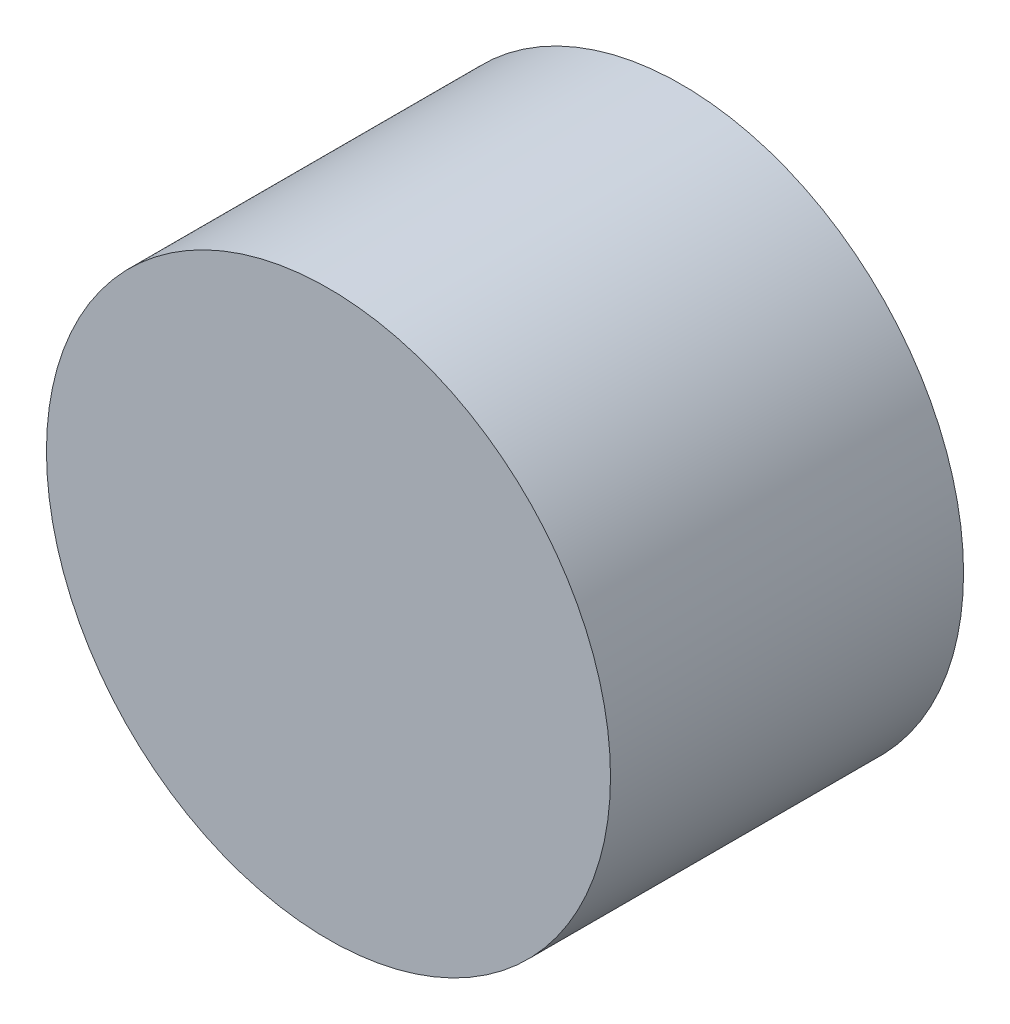
ISO-10303-21;
HEADER;
FILE_DESCRIPTION(('STEP AP214'),'2;1');
FILE_NAME('part.step','',(''),(''),'','','');
FILE_SCHEMA(('AUTOMOTIVE_DESIGN { 1 0 10303 214 1 1 1 1 }'));
ENDSEC;
DATA;
#1=APPLICATION_CONTEXT('core data for automotive mechanical design processes');
#2=APPLICATION_PROTOCOL_DEFINITION('international standard','automotive_design',2000,#1);
#3=PRODUCT_CONTEXT('',#1,'mechanical');
#4=PRODUCT('Part','Part','',(#3));
#5=PRODUCT_RELATED_PRODUCT_CATEGORY('part','',(#4));
#6=PRODUCT_DEFINITION_FORMATION('','',#4);
#7=PRODUCT_DEFINITION_CONTEXT('part definition',#1,'design');
#8=PRODUCT_DEFINITION('design','',#6,#7);
#9=PRODUCT_DEFINITION_SHAPE('','',#8);
#10=(LENGTH_UNIT() NAMED_UNIT(*) SI_UNIT(.MILLI.,.METRE.));
#11=(NAMED_UNIT(*) PLANE_ANGLE_UNIT() SI_UNIT($,.RADIAN.));
#12=(NAMED_UNIT(*) SI_UNIT($,.STERADIAN.) SOLID_ANGLE_UNIT());
#13=UNCERTAINTY_MEASURE_WITH_UNIT(LENGTH_MEASURE(1.E-05),#10,'distance_accuracy_value','');
#14=(GEOMETRIC_REPRESENTATION_CONTEXT(3) GLOBAL_UNCERTAINTY_ASSIGNED_CONTEXT((#13)) GLOBAL_UNIT_ASSIGNED_CONTEXT((#10,
#11,#12)) REPRESENTATION_CONTEXT('',''));
#15=CARTESIAN_POINT('',(0.,0.,0.));
#16=DIRECTION('',(0.,0.,1.));
#17=DIRECTION('',(1.,0.,0.));
#18=AXIS2_PLACEMENT_3D('',#15,#16,#17);
#19=CARTESIAN_POINT('',(-19.5880605457391,18.1475736568458,26.));
#20=DIRECTION('',(0.,0.,-1.));
#21=DIRECTION('',(-1.,0.,0.));
#22=AXIS2_PLACEMENT_3D('',#19,#20,#21);
#23=CYLINDRICAL_SURFACE('',#22,20.7701817802538);
#24=CARTESIAN_POINT('',(-19.5880605457391,18.1475736568458,26.));
#25=DIRECTION('',(0.,0.,1.));
#26=DIRECTION('',(1.,0.,0.));
#27=AXIS2_PLACEMENT_3D('',#24,#25,#26);
#28=CIRCLE('',#27,20.7701817802538);
#29=CARTESIAN_POINT('',(-40.3582423259929,18.1475736568458,26.));
#30=VERTEX_POINT('',#29);
#31=EDGE_CURVE('E10',#30,#30,#28,.T.);
#32=CARTESIAN_POINT('',(-19.5880605457391,18.1475736568458,0.));
#33=DIRECTION('',(0.,0.,1.));
#34=DIRECTION('',(1.,0.,0.));
#35=AXIS2_PLACEMENT_3D('',#32,#33,#34);
#36=CIRCLE('',#35,20.7701817802538);
#37=CARTESIAN_POINT('',(-40.3582423259929,18.1475736568458,0.));
#38=VERTEX_POINT('',#37);
#39=EDGE_CURVE('E40',#38,#38,#36,.T.);
#40=CARTESIAN_POINT('',(-40.3582423259929,18.1475736568458,26.));
#41=CARTESIAN_POINT('',(-40.3582423259929,18.1475736568458,25.7291666666667));
#42=CARTESIAN_POINT('',(-40.3582423259929,18.1475736568458,25.4583333333333));
#43=CARTESIAN_POINT('',(-40.3582423259929,18.1475736568458,24.9166666666667));
#44=CARTESIAN_POINT('',(-40.3582423259929,18.1475736568458,24.6458333333333));
#45=CARTESIAN_POINT('',(-40.3582423259929,18.1475736568458,24.1041666666667));
#46=CARTESIAN_POINT('',(-40.3582423259929,18.1475736568458,23.8333333333333));
#47=CARTESIAN_POINT('',(-40.3582423259929,18.1475736568458,23.2916666666667));
#48=CARTESIAN_POINT('',(-40.3582423259929,18.1475736568458,23.0208333333333));
#49=CARTESIAN_POINT('',(-40.3582423259929,18.1475736568458,22.4791666666667));
#50=CARTESIAN_POINT('',(-40.3582423259929,18.1475736568458,22.2083333333333));
#51=CARTESIAN_POINT('',(-40.3582423259929,18.1475736568458,21.6666666666667));
#52=CARTESIAN_POINT('',(-40.3582423259929,18.1475736568458,21.3958333333333));
#53=CARTESIAN_POINT('',(-40.3582423259929,18.1475736568458,20.8541666666667));
#54=CARTESIAN_POINT('',(-40.3582423259929,18.1475736568458,20.5833333333333));
#55=CARTESIAN_POINT('',(-40.3582423259929,18.1475736568458,20.0416666666667));
#56=CARTESIAN_POINT('',(-40.3582423259929,18.1475736568458,19.7708333333333));
#57=CARTESIAN_POINT('',(-40.3582423259929,18.1475736568458,19.2291666666667));
#58=CARTESIAN_POINT('',(-40.3582423259929,18.1475736568458,18.9583333333333));
#59=CARTESIAN_POINT('',(-40.3582423259929,18.1475736568458,18.4166666666667));
#60=CARTESIAN_POINT('',(-40.3582423259929,18.1475736568458,18.1458333333333));
#61=CARTESIAN_POINT('',(-40.3582423259929,18.1475736568458,17.6041666666667));
#62=CARTESIAN_POINT('',(-40.3582423259929,18.1475736568458,17.3333333333333));
#63=CARTESIAN_POINT('',(-40.3582423259929,18.1475736568458,16.7916666666667));
#64=CARTESIAN_POINT('',(-40.3582423259929,18.1475736568458,16.5208333333333));
#65=CARTESIAN_POINT('',(-40.3582423259929,18.1475736568458,15.9791666666667));
#66=CARTESIAN_POINT('',(-40.3582423259929,18.1475736568458,15.7083333333333));
#67=CARTESIAN_POINT('',(-40.3582423259929,18.1475736568458,15.1666666666667));
#68=CARTESIAN_POINT('',(-40.3582423259929,18.1475736568458,14.8958333333333));
#69=CARTESIAN_POINT('',(-40.3582423259929,18.1475736568458,14.3541666666667));
#70=CARTESIAN_POINT('',(-40.3582423259929,18.1475736568458,14.0833333333333));
#71=CARTESIAN_POINT('',(-40.3582423259929,18.1475736568458,13.5416666666667));
#72=CARTESIAN_POINT('',(-40.3582423259929,18.1475736568458,13.2708333333333));
#73=CARTESIAN_POINT('',(-40.3582423259929,18.1475736568458,12.7291666666667));
#74=CARTESIAN_POINT('',(-40.3582423259929,18.1475736568458,12.4583333333333));
#75=CARTESIAN_POINT('',(-40.3582423259929,18.1475736568458,11.9166666666667));
#76=CARTESIAN_POINT('',(-40.3582423259929,18.1475736568458,11.6458333333333));
#77=CARTESIAN_POINT('',(-40.3582423259929,18.1475736568458,11.1041666666667));
#78=CARTESIAN_POINT('',(-40.3582423259929,18.1475736568458,10.8333333333333));
#79=CARTESIAN_POINT('',(-40.3582423259929,18.1475736568458,10.2916666666667));
#80=CARTESIAN_POINT('',(-40.3582423259929,18.1475736568458,10.0208333333333));
#81=CARTESIAN_POINT('',(-40.3582423259929,18.1475736568458,9.47916666666667));
#82=CARTESIAN_POINT('',(-40.3582423259929,18.1475736568458,9.20833333333333));
#83=CARTESIAN_POINT('',(-40.3582423259929,18.1475736568458,8.66666666666667));
#84=CARTESIAN_POINT('',(-40.3582423259929,18.1475736568458,8.39583333333333));
#85=CARTESIAN_POINT('',(-40.3582423259929,18.1475736568458,7.85416666666667));
#86=CARTESIAN_POINT('',(-40.3582423259929,18.1475736568458,7.58333333333333));
#87=CARTESIAN_POINT('',(-40.3582423259929,18.1475736568458,7.04166666666667));
#88=CARTESIAN_POINT('',(-40.3582423259929,18.1475736568458,6.77083333333333));
#89=CARTESIAN_POINT('',(-40.3582423259929,18.1475736568458,6.22916666666667));
#90=CARTESIAN_POINT('',(-40.3582423259929,18.1475736568458,5.95833333333334));
#91=CARTESIAN_POINT('',(-40.3582423259929,18.1475736568458,5.41666666666667));
#92=CARTESIAN_POINT('',(-40.3582423259929,18.1475736568458,5.14583333333333));
#93=CARTESIAN_POINT('',(-40.3582423259929,18.1475736568458,4.60416666666667));
#94=CARTESIAN_POINT('',(-40.3582423259929,18.1475736568458,4.33333333333333));
#95=CARTESIAN_POINT('',(-40.3582423259929,18.1475736568458,3.79166666666667));
#96=CARTESIAN_POINT('',(-40.3582423259929,18.1475736568458,3.52083333333333));
#97=CARTESIAN_POINT('',(-40.3582423259929,18.1475736568458,2.97916666666667));
#98=CARTESIAN_POINT('',(-40.3582423259929,18.1475736568458,2.70833333333333));
#99=CARTESIAN_POINT('',(-40.3582423259929,18.1475736568458,2.16666666666667));
#100=CARTESIAN_POINT('',(-40.3582423259929,18.1475736568458,1.89583333333333));
#101=CARTESIAN_POINT('',(-40.3582423259929,18.1475736568458,1.35416666666666));
#102=CARTESIAN_POINT('',(-40.3582423259929,18.1475736568458,1.08333333333333));
#103=CARTESIAN_POINT('',(-40.3582423259929,18.1475736568458,0.541666666666664));
#104=CARTESIAN_POINT('',(-40.3582423259929,18.1475736568458,0.27083333333333));
#105=CARTESIAN_POINT('',(-40.3582423259929,18.1475736568458,0.));
#106=B_SPLINE_CURVE_WITH_KNOTS('',3,(#40,#41,#42,#43,#44,#45,#46,#47,#48,#49,#50,#51,#52,#53,
#54,#55,#56,#57,#58,#59,#60,#61,#62,#63,#64,#65,#66,#67,#68,#69,#70,#71,#72,#73,#74,#75,#76,#77,
#78,#79,#80,#81,#82,#83,#84,#85,#86,#87,#88,#89,#90,#91,#92,#93,#94,#95,#96,#97,#98,#99,#100,
#101,#102,#103,#104,#105),.UNSPECIFIED.,.F.,.F.,(4,2,2,2,2,2,2,2,2,2,2,2,2,2,2,2,2,2,2,2,2,2,2,
2,2,2,2,2,2,2,2,2,4),(0.,0.812500000000001,1.625,2.4375,3.25,4.0625,4.875,5.68750000000001,
6.50000000000001,7.31250000000001,8.12500000000001,8.93750000000001,9.75000000000001,10.5625,
11.375,12.1875,13.,13.8125,14.625,15.4375,16.25,17.0625,17.875,18.6875,19.5,20.3125,21.125,
21.9375,22.75,23.5625,24.375,25.1875,26.),.UNSPECIFIED.);
#107=EDGE_CURVE('BSEAM37',#30,#38,#106,.T.);
#108=ORIENTED_EDGE('',*,*,#31,.F.);
#109=ORIENTED_EDGE('',*,*,#39,.T.);
#110=ORIENTED_EDGE('',*,*,#107,.T.);
#111=ORIENTED_EDGE('',*,*,#107,.F.);
#112=EDGE_LOOP('',(#108,#110,#109,#111));
#113=FACE_BOUND('',#112,.T.);
#114=ADVANCED_FACE('F37',(#113),#23,.T.);
#115=CARTESIAN_POINT('',(-19.5880605457391,18.1475736568458,26.));
#116=DIRECTION('',(0.,0.,1.));
#117=DIRECTION('',(1.,0.,0.));
#118=AXIS2_PLACEMENT_3D('',#115,#116,#117);
#119=PLANE('',#118);
#120=ORIENTED_EDGE('',*,*,#31,.T.);
#121=EDGE_LOOP('',(#120));
#122=FACE_BOUND('',#121,.T.);
#123=ADVANCED_FACE('F54',(#122),#119,.T.);
#124=CARTESIAN_POINT('',(-19.5880605457391,18.1475736568458,0.));
#125=DIRECTION('',(0.,0.,1.));
#126=DIRECTION('',(1.,0.,0.));
#127=AXIS2_PLACEMENT_3D('',#124,#125,#126);
#128=PLANE('',#127);
#129=ORIENTED_EDGE('',*,*,#39,.F.);
#130=EDGE_LOOP('',(#129));
#131=FACE_BOUND('',#130,.T.);
#132=ADVANCED_FACE('F52',(#131),#128,.F.);
#133=CLOSED_SHELL('',(#114,#123,#132));
#134=MANIFOLD_SOLID_BREP('B2',#133);
#135=ADVANCED_BREP_SHAPE_REPRESENTATION('',(#18,#134),#14);
#136=SHAPE_DEFINITION_REPRESENTATION(#9,#135);
ENDSEC;
END-ISO-10303-21;
